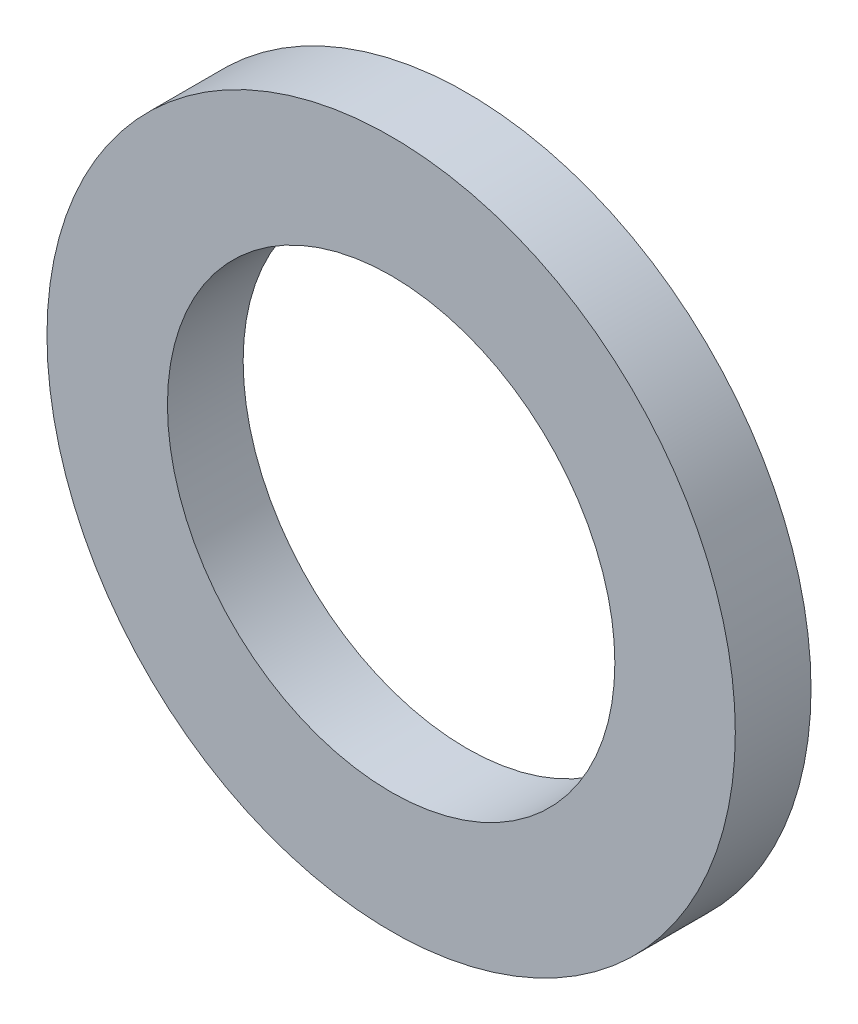
ISO-10303-21;
HEADER;
FILE_DESCRIPTION(('STEP AP214'),'2;1');
FILE_NAME('part.step','',(''),(''),'','','');
FILE_SCHEMA(('AUTOMOTIVE_DESIGN { 1 0 10303 214 1 1 1 1 }'));
ENDSEC;
DATA;
#1=APPLICATION_CONTEXT('core data for automotive mechanical design processes');
#2=APPLICATION_PROTOCOL_DEFINITION('international standard','automotive_design',2000,#1);
#3=PRODUCT_CONTEXT('',#1,'mechanical');
#4=PRODUCT('Part','Part','',(#3));
#5=PRODUCT_RELATED_PRODUCT_CATEGORY('part','',(#4));
#6=PRODUCT_DEFINITION_FORMATION('','',#4);
#7=PRODUCT_DEFINITION_CONTEXT('part definition',#1,'design');
#8=PRODUCT_DEFINITION('design','',#6,#7);
#9=PRODUCT_DEFINITION_SHAPE('','',#8);
#10=(LENGTH_UNIT() NAMED_UNIT(*) SI_UNIT(.MILLI.,.METRE.));
#11=(NAMED_UNIT(*) PLANE_ANGLE_UNIT() SI_UNIT($,.RADIAN.));
#12=(NAMED_UNIT(*) SI_UNIT($,.STERADIAN.) SOLID_ANGLE_UNIT());
#13=UNCERTAINTY_MEASURE_WITH_UNIT(LENGTH_MEASURE(1.E-05),#10,'distance_accuracy_value','');
#14=(GEOMETRIC_REPRESENTATION_CONTEXT(3) GLOBAL_UNCERTAINTY_ASSIGNED_CONTEXT((#13)) GLOBAL_UNIT_ASSIGNED_CONTEXT((#10,
#11,#12)) REPRESENTATION_CONTEXT('',''));
#15=CARTESIAN_POINT('',(0.,0.,0.));
#16=DIRECTION('',(0.,0.,1.));
#17=DIRECTION('',(1.,0.,0.));
#18=AXIS2_PLACEMENT_3D('',#15,#16,#17);
#19=CARTESIAN_POINT('',(0.,0.,2.2));
#20=DIRECTION('',(0.,0.,1.));
#21=DIRECTION('',(1.,0.,0.));
#22=AXIS2_PLACEMENT_3D('',#19,#20,#21);
#23=PLANE('',#22);
#24=CARTESIAN_POINT('',(0.,0.,2.2));
#25=DIRECTION('',(0.,0.,1.));
#26=DIRECTION('',(1.,0.,0.));
#27=AXIS2_PLACEMENT_3D('',#24,#25,#26);
#28=CIRCLE('',#27,10.);
#29=CARTESIAN_POINT('',(10.,0.,2.2));
#30=VERTEX_POINT('',#29);
#31=EDGE_CURVE('E10',#30,#30,#28,.T.);
#32=ORIENTED_EDGE('',*,*,#31,.T.);
#33=EDGE_LOOP('',(#32));
#34=FACE_BOUND('',#33,.T.);
#35=CARTESIAN_POINT('',(0.,0.,2.2));
#36=DIRECTION('',(0.,0.,1.));
#37=DIRECTION('',(1.,0.,0.));
#38=AXIS2_PLACEMENT_3D('',#35,#36,#37);
#39=CIRCLE('',#38,6.5);
#40=CARTESIAN_POINT('',(6.5,0.,2.2));
#41=VERTEX_POINT('',#40);
#42=EDGE_CURVE('E41',#41,#41,#39,.T.);
#43=ORIENTED_EDGE('',*,*,#42,.F.);
#44=EDGE_LOOP('',(#43));
#45=FACE_BOUND('',#44,.T.);
#46=ADVANCED_FACE('F30',(#34,#45),#23,.T.);
#47=CARTESIAN_POINT('',(0.,0.,0.));
#48=DIRECTION('',(0.,0.,1.));
#49=DIRECTION('',(1.,0.,0.));
#50=AXIS2_PLACEMENT_3D('',#47,#48,#49);
#51=PLANE('',#50);
#52=CARTESIAN_POINT('',(0.,0.,0.));
#53=DIRECTION('',(0.,0.,1.));
#54=DIRECTION('',(1.,0.,0.));
#55=AXIS2_PLACEMENT_3D('',#52,#53,#54);
#56=CIRCLE('',#55,10.);
#57=CARTESIAN_POINT('',(10.,0.,0.));
#58=VERTEX_POINT('',#57);
#59=EDGE_CURVE('E34',#58,#58,#56,.T.);
#60=ORIENTED_EDGE('',*,*,#59,.F.);
#61=EDGE_LOOP('',(#60));
#62=FACE_BOUND('',#61,.T.);
#63=CARTESIAN_POINT('',(0.,0.,0.));
#64=DIRECTION('',(0.,0.,1.));
#65=DIRECTION('',(1.,0.,0.));
#66=AXIS2_PLACEMENT_3D('',#63,#64,#65);
#67=CIRCLE('',#66,6.5);
#68=CARTESIAN_POINT('',(6.5,0.,0.));
#69=VERTEX_POINT('',#68);
#70=EDGE_CURVE('E43',#69,#69,#67,.T.);
#71=ORIENTED_EDGE('',*,*,#70,.T.);
#72=EDGE_LOOP('',(#71));
#73=FACE_BOUND('',#72,.T.);
#74=ADVANCED_FACE('F53',(#62,#73),#51,.F.);
#75=CARTESIAN_POINT('',(0.,0.,2.2));
#76=DIRECTION('',(0.,0.,-1.));
#77=DIRECTION('',(-1.,0.,0.));
#78=AXIS2_PLACEMENT_3D('',#75,#76,#77);
#79=CYLINDRICAL_SURFACE('',#78,10.);
#80=ORIENTED_EDGE('',*,*,#31,.F.);
#81=EDGE_LOOP('',(#80));
#82=FACE_BOUND('',#81,.T.);
#83=ORIENTED_EDGE('',*,*,#59,.T.);
#84=EDGE_LOOP('',(#83));
#85=FACE_BOUND('',#84,.T.);
#86=ADVANCED_FACE('F32',(#82,#85),#79,.T.);
#87=CARTESIAN_POINT('',(0.,0.,2.2));
#88=DIRECTION('',(0.,0.,-1.));
#89=DIRECTION('',(-1.,0.,0.));
#90=AXIS2_PLACEMENT_3D('',#87,#88,#89);
#91=CYLINDRICAL_SURFACE('',#90,6.5);
#92=ORIENTED_EDGE('',*,*,#42,.T.);
#93=EDGE_LOOP('',(#92));
#94=FACE_BOUND('',#93,.T.);
#95=ORIENTED_EDGE('',*,*,#70,.F.);
#96=EDGE_LOOP('',(#95));
#97=FACE_BOUND('',#96,.T.);
#98=ADVANCED_FACE('F49',(#94,#97),#91,.F.);
#99=CLOSED_SHELL('',(#46,#74,#86,#98));
#100=MANIFOLD_SOLID_BREP('B2',#99);
#101=ADVANCED_BREP_SHAPE_REPRESENTATION('',(#18,#100),#14);
#102=SHAPE_DEFINITION_REPRESENTATION(#9,#101);
ENDSEC;
END-ISO-10303-21;
